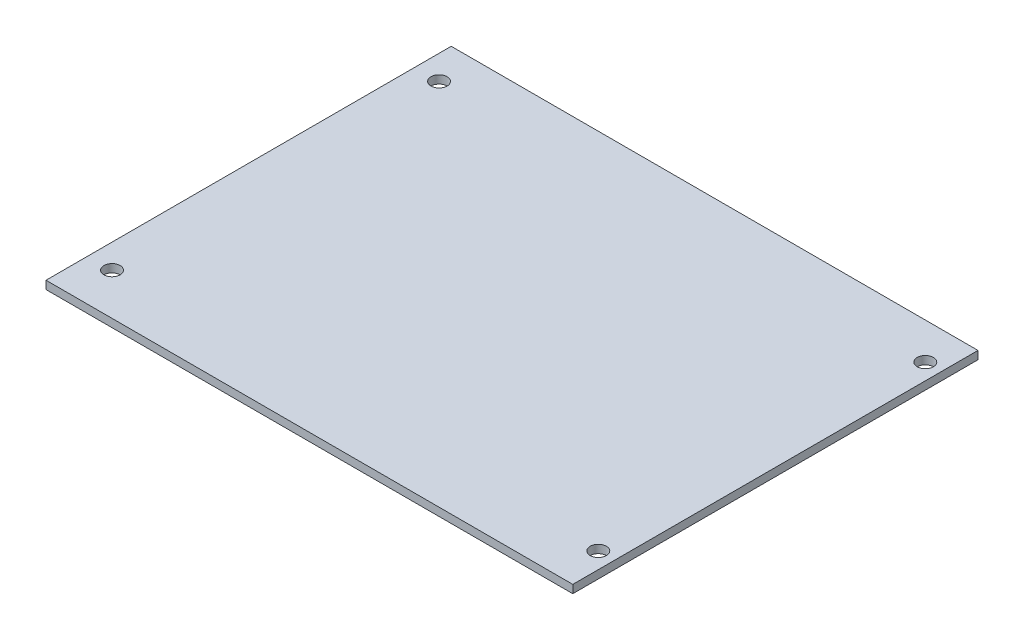
ISO-10303-21;
HEADER;
FILE_DESCRIPTION(('STEP AP214'),'2;1');
FILE_NAME('part.step','',(''),(''),'','','');
FILE_SCHEMA(('AUTOMOTIVE_DESIGN { 1 0 10303 214 1 1 1 1 }'));
ENDSEC;
DATA;
#1=APPLICATION_CONTEXT('core data for automotive mechanical design processes');
#2=APPLICATION_PROTOCOL_DEFINITION('international standard','automotive_design',2000,#1);
#3=PRODUCT_CONTEXT('',#1,'mechanical');
#4=PRODUCT('Part','Part','',(#3));
#5=PRODUCT_RELATED_PRODUCT_CATEGORY('part','',(#4));
#6=PRODUCT_DEFINITION_FORMATION('','',#4);
#7=PRODUCT_DEFINITION_CONTEXT('part definition',#1,'design');
#8=PRODUCT_DEFINITION('design','',#6,#7);
#9=PRODUCT_DEFINITION_SHAPE('','',#8);
#10=(LENGTH_UNIT() NAMED_UNIT(*) SI_UNIT(.MILLI.,.METRE.));
#11=(NAMED_UNIT(*) PLANE_ANGLE_UNIT() SI_UNIT($,.RADIAN.));
#12=(NAMED_UNIT(*) SI_UNIT($,.STERADIAN.) SOLID_ANGLE_UNIT());
#13=UNCERTAINTY_MEASURE_WITH_UNIT(LENGTH_MEASURE(1.E-05),#10,'distance_accuracy_value','');
#14=(GEOMETRIC_REPRESENTATION_CONTEXT(3) GLOBAL_UNCERTAINTY_ASSIGNED_CONTEXT((#13)) GLOBAL_UNIT_ASSIGNED_CONTEXT((#10,
#11,#12)) REPRESENTATION_CONTEXT('',''));
#15=CARTESIAN_POINT('',(0.,0.,0.));
#16=DIRECTION('',(0.,0.,1.));
#17=DIRECTION('',(1.,0.,0.));
#18=AXIS2_PLACEMENT_3D('',#15,#16,#17);
#19=CARTESIAN_POINT('',(0.,2.,0.));
#20=DIRECTION('',(0.,-1.,0.));
#21=DIRECTION('',(0.,0.,-1.));
#22=AXIS2_PLACEMENT_3D('',#19,#20,#21);
#23=PLANE('',#22);
#24=DIRECTION('',(0.,0.,1.));
#25=VECTOR('',#24,1.);
#26=CARTESIAN_POINT('',(0.,2.,0.));
#27=LINE('',#26,#25);
#28=CARTESIAN_POINT('',(0.,2.,-100.));
#29=VERTEX_POINT('',#28);
#30=CARTESIAN_POINT('',(0.,2.,0.));
#31=VERTEX_POINT('',#30);
#32=EDGE_CURVE('E85',#29,#31,#27,.T.);
#33=ORIENTED_EDGE('',*,*,#32,.T.);
#34=DIRECTION('',(1.,0.,0.));
#35=VECTOR('',#34,1.);
#36=CARTESIAN_POINT('',(0.,2.,0.));
#37=LINE('',#36,#35);
#38=CARTESIAN_POINT('',(130.,2.,0.));
#39=VERTEX_POINT('',#38);
#40=EDGE_CURVE('E80',#31,#39,#37,.T.);
#41=ORIENTED_EDGE('',*,*,#40,.T.);
#42=DIRECTION('',(0.,0.,-1.));
#43=VECTOR('',#42,1.);
#44=CARTESIAN_POINT('',(130.,2.,0.));
#45=LINE('',#44,#43);
#46=CARTESIAN_POINT('',(130.,2.,-100.));
#47=VERTEX_POINT('',#46);
#48=EDGE_CURVE('E83',#39,#47,#45,.T.);
#49=ORIENTED_EDGE('',*,*,#48,.T.);
#50=DIRECTION('',(-1.,0.,0.));
#51=VECTOR('',#50,1.);
#52=CARTESIAN_POINT('',(0.,2.,-100.));
#53=LINE('',#52,#51);
#54=EDGE_CURVE('E50',#47,#29,#53,.T.);
#55=ORIENTED_EDGE('',*,*,#54,.T.);
#56=EDGE_LOOP('',(#33,#41,#49,#55));
#57=FACE_BOUND('',#56,.T.);
#58=CARTESIAN_POINT('',(6.,2.,-10.3));
#59=DIRECTION('',(0.,1.,0.));
#60=DIRECTION('',(0.,0.,1.));
#61=AXIS2_PLACEMENT_3D('',#58,#59,#60);
#62=CIRCLE('',#61,2.);
#63=CARTESIAN_POINT('',(6.,2.,-8.3));
#64=VERTEX_POINT('',#63);
#65=EDGE_CURVE('E100',#64,#64,#62,.T.);
#66=ORIENTED_EDGE('',*,*,#65,.F.);
#67=EDGE_LOOP('',(#66));
#68=FACE_BOUND('',#67,.T.);
#69=CARTESIAN_POINT('',(126.,2.,-10.3));
#70=DIRECTION('',(0.,1.,0.));
#71=DIRECTION('',(0.,0.,1.));
#72=AXIS2_PLACEMENT_3D('',#69,#70,#71);
#73=CIRCLE('',#72,2.);
#74=CARTESIAN_POINT('',(126.,2.,-8.3));
#75=VERTEX_POINT('',#74);
#76=EDGE_CURVE('E115',#75,#75,#73,.T.);
#77=ORIENTED_EDGE('',*,*,#76,.F.);
#78=EDGE_LOOP('',(#77));
#79=FACE_BOUND('',#78,.T.);
#80=CARTESIAN_POINT('',(126.,2.,-91.));
#81=DIRECTION('',(0.,1.,0.));
#82=DIRECTION('',(0.,0.,1.));
#83=AXIS2_PLACEMENT_3D('',#80,#81,#82);
#84=CIRCLE('',#83,2.);
#85=CARTESIAN_POINT('',(126.,2.,-89.));
#86=VERTEX_POINT('',#85);
#87=EDGE_CURVE('E121',#86,#86,#84,.T.);
#88=ORIENTED_EDGE('',*,*,#87,.F.);
#89=EDGE_LOOP('',(#88));
#90=FACE_BOUND('',#89,.T.);
#91=CARTESIAN_POINT('',(6.,2.,-91.));
#92=DIRECTION('',(0.,1.,0.));
#93=DIRECTION('',(0.,0.,1.));
#94=AXIS2_PLACEMENT_3D('',#91,#92,#93);
#95=CIRCLE('',#94,2.);
#96=CARTESIAN_POINT('',(6.,2.,-89.));
#97=VERTEX_POINT('',#96);
#98=EDGE_CURVE('E127',#97,#97,#95,.T.);
#99=ORIENTED_EDGE('',*,*,#98,.F.);
#100=EDGE_LOOP('',(#99));
#101=FACE_BOUND('',#100,.T.);
#102=ADVANCED_FACE('F33',(#57,#68,#79,#90,#101),#23,.F.);
#103=CARTESIAN_POINT('',(0.,0.,0.));
#104=DIRECTION('',(0.,-1.,0.));
#105=DIRECTION('',(0.,0.,-1.));
#106=AXIS2_PLACEMENT_3D('',#103,#104,#105);
#107=PLANE('',#106);
#108=CARTESIAN_POINT('',(126.,0.,-91.));
#109=DIRECTION('',(0.,1.,0.));
#110=DIRECTION('',(0.,0.,1.));
#111=AXIS2_PLACEMENT_3D('',#108,#109,#110);
#112=CIRCLE('',#111,2.);
#113=CARTESIAN_POINT('',(126.,0.,-89.));
#114=VERTEX_POINT('',#113);
#115=EDGE_CURVE('E124',#114,#114,#112,.T.);
#116=ORIENTED_EDGE('',*,*,#115,.T.);
#117=EDGE_LOOP('',(#116));
#118=FACE_BOUND('',#117,.T.);
#119=CARTESIAN_POINT('',(6.,0.,-10.3));
#120=DIRECTION('',(0.,1.,0.));
#121=DIRECTION('',(0.,0.,1.));
#122=AXIS2_PLACEMENT_3D('',#119,#120,#121);
#123=CIRCLE('',#122,2.);
#124=CARTESIAN_POINT('',(6.,0.,-8.3));
#125=VERTEX_POINT('',#124);
#126=EDGE_CURVE('E112',#125,#125,#123,.T.);
#127=ORIENTED_EDGE('',*,*,#126,.T.);
#128=EDGE_LOOP('',(#127));
#129=FACE_BOUND('',#128,.T.);
#130=DIRECTION('',(0.,0.,1.));
#131=VECTOR('',#130,1.);
#132=CARTESIAN_POINT('',(0.,0.,0.));
#133=LINE('',#132,#131);
#134=CARTESIAN_POINT('',(0.,0.,-100.));
#135=VERTEX_POINT('',#134);
#136=CARTESIAN_POINT('',(0.,0.,0.));
#137=VERTEX_POINT('',#136);
#138=EDGE_CURVE('E97',#135,#137,#133,.T.);
#139=ORIENTED_EDGE('',*,*,#138,.F.);
#140=DIRECTION('',(-1.,0.,0.));
#141=VECTOR('',#140,1.);
#142=CARTESIAN_POINT('',(0.,0.,-100.));
#143=LINE('',#142,#141);
#144=CARTESIAN_POINT('',(130.,0.,-100.));
#145=VERTEX_POINT('',#144);
#146=EDGE_CURVE('E73',#145,#135,#143,.T.);
#147=ORIENTED_EDGE('',*,*,#146,.F.);
#148=DIRECTION('',(0.,0.,-1.));
#149=VECTOR('',#148,1.);
#150=CARTESIAN_POINT('',(130.,0.,0.));
#151=LINE('',#150,#149);
#152=CARTESIAN_POINT('',(130.,0.,0.));
#153=VERTEX_POINT('',#152);
#154=EDGE_CURVE('E67',#153,#145,#151,.T.);
#155=ORIENTED_EDGE('',*,*,#154,.F.);
#156=DIRECTION('',(1.,0.,0.));
#157=VECTOR('',#156,1.);
#158=CARTESIAN_POINT('',(0.,0.,0.));
#159=LINE('',#158,#157);
#160=EDGE_CURVE('E89',#137,#153,#159,.T.);
#161=ORIENTED_EDGE('',*,*,#160,.F.);
#162=EDGE_LOOP('',(#139,#147,#155,#161));
#163=FACE_BOUND('',#162,.T.);
#164=CARTESIAN_POINT('',(126.,0.,-10.3));
#165=DIRECTION('',(0.,1.,0.));
#166=DIRECTION('',(0.,0.,1.));
#167=AXIS2_PLACEMENT_3D('',#164,#165,#166);
#168=CIRCLE('',#167,2.);
#169=CARTESIAN_POINT('',(126.,0.,-8.3));
#170=VERTEX_POINT('',#169);
#171=EDGE_CURVE('E118',#170,#170,#168,.T.);
#172=ORIENTED_EDGE('',*,*,#171,.T.);
#173=EDGE_LOOP('',(#172));
#174=FACE_BOUND('',#173,.T.);
#175=CARTESIAN_POINT('',(6.,0.,-91.));
#176=DIRECTION('',(0.,1.,0.));
#177=DIRECTION('',(0.,0.,1.));
#178=AXIS2_PLACEMENT_3D('',#175,#176,#177);
#179=CIRCLE('',#178,2.);
#180=CARTESIAN_POINT('',(6.,0.,-89.));
#181=VERTEX_POINT('',#180);
#182=EDGE_CURVE('E130',#181,#181,#179,.T.);
#183=ORIENTED_EDGE('',*,*,#182,.T.);
#184=EDGE_LOOP('',(#183));
#185=FACE_BOUND('',#184,.T.);
#186=ADVANCED_FACE('F108',(#118,#129,#163,#174,#185),#107,.T.);
#187=CARTESIAN_POINT('',(0.,2.,0.));
#188=DIRECTION('',(1.,0.,0.));
#189=DIRECTION('',(0.,0.,-1.));
#190=AXIS2_PLACEMENT_3D('',#187,#188,#189);
#191=PLANE('',#190);
#192=ORIENTED_EDGE('',*,*,#138,.T.);
#193=DIRECTION('',(0.,-1.,0.));
#194=VECTOR('',#193,1.);
#195=CARTESIAN_POINT('',(0.,2.,0.));
#196=LINE('',#195,#194);
#197=EDGE_CURVE('E11',#31,#137,#196,.T.);
#198=ORIENTED_EDGE('',*,*,#197,.F.);
#199=ORIENTED_EDGE('',*,*,#32,.F.);
#200=DIRECTION('',(0.,-1.,0.));
#201=VECTOR('',#200,1.);
#202=CARTESIAN_POINT('',(0.,2.,-100.));
#203=LINE('',#202,#201);
#204=EDGE_CURVE('E93',#29,#135,#203,.T.);
#205=ORIENTED_EDGE('',*,*,#204,.T.);
#206=EDGE_LOOP('',(#192,#198,#199,#205));
#207=FACE_BOUND('',#206,.T.);
#208=ADVANCED_FACE('F35',(#207),#191,.F.);
#209=CARTESIAN_POINT('',(0.,2.,0.));
#210=DIRECTION('',(0.,0.,-1.));
#211=DIRECTION('',(-1.,0.,0.));
#212=AXIS2_PLACEMENT_3D('',#209,#210,#211);
#213=PLANE('',#212);
#214=ORIENTED_EDGE('',*,*,#160,.T.);
#215=DIRECTION('',(0.,-1.,0.));
#216=VECTOR('',#215,1.);
#217=CARTESIAN_POINT('',(130.,2.,0.));
#218=LINE('',#217,#216);
#219=EDGE_CURVE('E42',#39,#153,#218,.T.);
#220=ORIENTED_EDGE('',*,*,#219,.F.);
#221=ORIENTED_EDGE('',*,*,#40,.F.);
#222=ORIENTED_EDGE('',*,*,#197,.T.);
#223=EDGE_LOOP('',(#214,#220,#221,#222));
#224=FACE_BOUND('',#223,.T.);
#225=ADVANCED_FACE('F88',(#224),#213,.F.);
#226=CARTESIAN_POINT('',(130.,2.,0.));
#227=DIRECTION('',(-1.,0.,0.));
#228=DIRECTION('',(0.,0.,1.));
#229=AXIS2_PLACEMENT_3D('',#226,#227,#228);
#230=PLANE('',#229);
#231=ORIENTED_EDGE('',*,*,#154,.T.);
#232=DIRECTION('',(0.,-1.,0.));
#233=VECTOR('',#232,1.);
#234=CARTESIAN_POINT('',(130.,2.,-100.));
#235=LINE('',#234,#233);
#236=EDGE_CURVE('E90',#47,#145,#235,.T.);
#237=ORIENTED_EDGE('',*,*,#236,.F.);
#238=ORIENTED_EDGE('',*,*,#48,.F.);
#239=ORIENTED_EDGE('',*,*,#219,.T.);
#240=EDGE_LOOP('',(#231,#237,#238,#239));
#241=FACE_BOUND('',#240,.T.);
#242=ADVANCED_FACE('F91',(#241),#230,.F.);
#243=CARTESIAN_POINT('',(0.,2.,-100.));
#244=DIRECTION('',(0.,0.,1.));
#245=DIRECTION('',(1.,0.,0.));
#246=AXIS2_PLACEMENT_3D('',#243,#244,#245);
#247=PLANE('',#246);
#248=ORIENTED_EDGE('',*,*,#146,.T.);
#249=ORIENTED_EDGE('',*,*,#204,.F.);
#250=ORIENTED_EDGE('',*,*,#54,.F.);
#251=ORIENTED_EDGE('',*,*,#236,.T.);
#252=EDGE_LOOP('',(#248,#249,#250,#251));
#253=FACE_BOUND('',#252,.T.);
#254=ADVANCED_FACE('F105',(#253),#247,.F.);
#255=CARTESIAN_POINT('',(6.,2.,-10.3));
#256=DIRECTION('',(0.,-1.,0.));
#257=DIRECTION('',(0.,0.,-1.));
#258=AXIS2_PLACEMENT_3D('',#255,#256,#257);
#259=CYLINDRICAL_SURFACE('',#258,2.);
#260=ORIENTED_EDGE('',*,*,#65,.T.);
#261=EDGE_LOOP('',(#260));
#262=FACE_BOUND('',#261,.T.);
#263=ORIENTED_EDGE('',*,*,#126,.F.);
#264=EDGE_LOOP('',(#263));
#265=FACE_BOUND('',#264,.T.);
#266=ADVANCED_FACE('F147',(#262,#265),#259,.F.);
#267=CARTESIAN_POINT('',(126.,2.,-10.3));
#268=DIRECTION('',(0.,-1.,0.));
#269=DIRECTION('',(0.,0.,-1.));
#270=AXIS2_PLACEMENT_3D('',#267,#268,#269);
#271=CYLINDRICAL_SURFACE('',#270,2.);
#272=ORIENTED_EDGE('',*,*,#76,.T.);
#273=EDGE_LOOP('',(#272));
#274=FACE_BOUND('',#273,.T.);
#275=ORIENTED_EDGE('',*,*,#171,.F.);
#276=EDGE_LOOP('',(#275));
#277=FACE_BOUND('',#276,.T.);
#278=ADVANCED_FACE('F193',(#274,#277),#271,.F.);
#279=CARTESIAN_POINT('',(126.,2.,-91.));
#280=DIRECTION('',(0.,-1.,0.));
#281=DIRECTION('',(0.,0.,-1.));
#282=AXIS2_PLACEMENT_3D('',#279,#280,#281);
#283=CYLINDRICAL_SURFACE('',#282,2.);
#284=ORIENTED_EDGE('',*,*,#87,.T.);
#285=EDGE_LOOP('',(#284));
#286=FACE_BOUND('',#285,.T.);
#287=ORIENTED_EDGE('',*,*,#115,.F.);
#288=EDGE_LOOP('',(#287));
#289=FACE_BOUND('',#288,.T.);
#290=ADVANCED_FACE('F201',(#286,#289),#283,.F.);
#291=CARTESIAN_POINT('',(6.,2.,-91.));
#292=DIRECTION('',(0.,-1.,0.));
#293=DIRECTION('',(0.,0.,-1.));
#294=AXIS2_PLACEMENT_3D('',#291,#292,#293);
#295=CYLINDRICAL_SURFACE('',#294,2.);
#296=ORIENTED_EDGE('',*,*,#98,.T.);
#297=EDGE_LOOP('',(#296));
#298=FACE_BOUND('',#297,.T.);
#299=ORIENTED_EDGE('',*,*,#182,.F.);
#300=EDGE_LOOP('',(#299));
#301=FACE_BOUND('',#300,.T.);
#302=ADVANCED_FACE('F136',(#298,#301),#295,.F.);
#303=CLOSED_SHELL('',(#102,#186,#208,#225,#242,#254,#266,#278,#290,#302));
#304=MANIFOLD_SOLID_BREP('B2',#303);
#305=ADVANCED_BREP_SHAPE_REPRESENTATION('',(#18,#304),#14);
#306=SHAPE_DEFINITION_REPRESENTATION(#9,#305);
ENDSEC;
END-ISO-10303-21;
